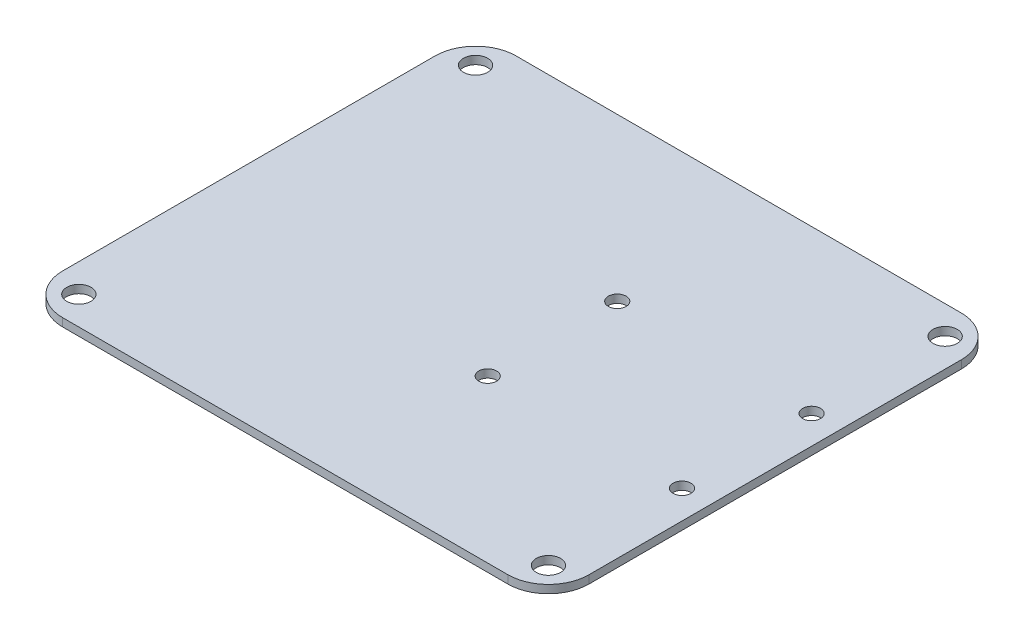
ISO-10303-21;
HEADER;
FILE_DESCRIPTION(('STEP AP214'),'2;1');
FILE_NAME('part.step','',(''),(''),'','','');
FILE_SCHEMA(('AUTOMOTIVE_DESIGN { 1 0 10303 214 1 1 1 1 }'));
ENDSEC;
DATA;
#1=APPLICATION_CONTEXT('core data for automotive mechanical design processes');
#2=APPLICATION_PROTOCOL_DEFINITION('international standard','automotive_design',2000,#1);
#3=PRODUCT_CONTEXT('',#1,'mechanical');
#4=PRODUCT('Part','Part','',(#3));
#5=PRODUCT_RELATED_PRODUCT_CATEGORY('part','',(#4));
#6=PRODUCT_DEFINITION_FORMATION('','',#4);
#7=PRODUCT_DEFINITION_CONTEXT('part definition',#1,'design');
#8=PRODUCT_DEFINITION('design','',#6,#7);
#9=PRODUCT_DEFINITION_SHAPE('','',#8);
#10=(LENGTH_UNIT() NAMED_UNIT(*) SI_UNIT(.MILLI.,.METRE.));
#11=(NAMED_UNIT(*) PLANE_ANGLE_UNIT() SI_UNIT($,.RADIAN.));
#12=(NAMED_UNIT(*) SI_UNIT($,.STERADIAN.) SOLID_ANGLE_UNIT());
#13=UNCERTAINTY_MEASURE_WITH_UNIT(LENGTH_MEASURE(1.E-05),#10,'distance_accuracy_value','');
#14=(GEOMETRIC_REPRESENTATION_CONTEXT(3) GLOBAL_UNCERTAINTY_ASSIGNED_CONTEXT((#13)) GLOBAL_UNIT_ASSIGNED_CONTEXT((#10,
#11,#12)) REPRESENTATION_CONTEXT('',''));
#15=CARTESIAN_POINT('',(0.,0.,0.));
#16=DIRECTION('',(0.,0.,1.));
#17=DIRECTION('',(1.,0.,0.));
#18=AXIS2_PLACEMENT_3D('',#15,#16,#17);
#19=CARTESIAN_POINT('',(61.5,1.,0.));
#20=DIRECTION('',(1.,0.,0.));
#21=DIRECTION('',(0.,0.,-1.));
#22=AXIS2_PLACEMENT_3D('',#19,#20,#21);
#23=PLANE('',#22);
#24=DIRECTION('',(0.,0.,1.));
#25=VECTOR('',#24,1.);
#26=CARTESIAN_POINT('',(61.5,1.,0.));
#27=LINE('',#26,#25);
#28=CARTESIAN_POINT('',(61.5,1.,1.49999999999999));
#29=VERTEX_POINT('',#28);
#30=CARTESIAN_POINT('',(61.5,1.,47.5));
#31=VERTEX_POINT('',#30);
#32=EDGE_CURVE('E189',#29,#31,#27,.T.);
#33=ORIENTED_EDGE('',*,*,#32,.T.);
#34=DIRECTION('',(0.,-1.,0.));
#35=VECTOR('',#34,1.);
#36=CARTESIAN_POINT('',(61.5,0.,47.5));
#37=LINE('',#36,#35);
#38=CARTESIAN_POINT('',(61.5,0.,47.5));
#39=VERTEX_POINT('',#38);
#40=EDGE_CURVE('E132',#31,#39,#37,.T.);
#41=ORIENTED_EDGE('',*,*,#40,.T.);
#42=DIRECTION('',(0.,0.,1.));
#43=VECTOR('',#42,1.);
#44=CARTESIAN_POINT('',(61.5,0.,0.));
#45=LINE('',#44,#43);
#46=CARTESIAN_POINT('',(61.5,0.,1.49999999999999));
#47=VERTEX_POINT('',#46);
#48=EDGE_CURVE('E115',#47,#39,#45,.T.);
#49=ORIENTED_EDGE('',*,*,#48,.F.);
#50=DIRECTION('',(0.,-1.,0.));
#51=VECTOR('',#50,1.);
#52=CARTESIAN_POINT('',(61.5,1.,1.49999999999999));
#53=LINE('',#52,#51);
#54=EDGE_CURVE('E129',#47,#29,#53,.F.);
#55=ORIENTED_EDGE('',*,*,#54,.T.);
#56=EDGE_LOOP('',(#33,#41,#49,#55));
#57=FACE_BOUND('',#56,.T.);
#58=ADVANCED_FACE('F44',(#57),#23,.T.);
#59=CARTESIAN_POINT('',(0.,1.,-3.5));
#60=DIRECTION('',(0.,0.,1.));
#61=DIRECTION('',(1.,0.,0.));
#62=AXIS2_PLACEMENT_3D('',#59,#60,#61);
#63=PLANE('',#62);
#64=DIRECTION('',(-1.,0.,0.));
#65=VECTOR('',#64,1.);
#66=CARTESIAN_POINT('',(0.,1.,-3.5));
#67=LINE('',#66,#65);
#68=CARTESIAN_POINT('',(56.5,1.,-3.50000000000001));
#69=VERTEX_POINT('',#68);
#70=CARTESIAN_POINT('',(1.5,1.,-3.5));
#71=VERTEX_POINT('',#70);
#72=EDGE_CURVE('E186',#69,#71,#67,.T.);
#73=ORIENTED_EDGE('',*,*,#72,.F.);
#74=DIRECTION('',(0.,-1.,0.));
#75=VECTOR('',#74,1.);
#76=CARTESIAN_POINT('',(56.5,0.,-3.50000000000001));
#77=LINE('',#76,#75);
#78=CARTESIAN_POINT('',(56.5,0.,-3.50000000000001));
#79=VERTEX_POINT('',#78);
#80=EDGE_CURVE('E179',#69,#79,#77,.T.);
#81=ORIENTED_EDGE('',*,*,#80,.T.);
#82=DIRECTION('',(-1.,0.,0.));
#83=VECTOR('',#82,1.);
#84=CARTESIAN_POINT('',(0.,0.,-3.5));
#85=LINE('',#84,#83);
#86=CARTESIAN_POINT('',(1.5,0.,-3.5));
#87=VERTEX_POINT('',#86);
#88=EDGE_CURVE('E117',#79,#87,#85,.T.);
#89=ORIENTED_EDGE('',*,*,#88,.T.);
#90=DIRECTION('',(0.,-1.,0.));
#91=VECTOR('',#90,1.);
#92=CARTESIAN_POINT('',(1.5,1.,-3.5));
#93=LINE('',#92,#91);
#94=EDGE_CURVE('E176',#87,#71,#93,.F.);
#95=ORIENTED_EDGE('',*,*,#94,.T.);
#96=EDGE_LOOP('',(#73,#81,#89,#95));
#97=FACE_BOUND('',#96,.T.);
#98=ADVANCED_FACE('F184',(#97),#63,.F.);
#99=CARTESIAN_POINT('',(-3.5,1.,0.));
#100=DIRECTION('',(1.,0.,0.));
#101=DIRECTION('',(0.,0.,-1.));
#102=AXIS2_PLACEMENT_3D('',#99,#100,#101);
#103=PLANE('',#102);
#104=DIRECTION('',(0.,0.,1.));
#105=VECTOR('',#104,1.);
#106=CARTESIAN_POINT('',(-3.5,1.,0.));
#107=LINE('',#106,#105);
#108=CARTESIAN_POINT('',(-3.5,1.,1.5));
#109=VERTEX_POINT('',#108);
#110=CARTESIAN_POINT('',(-3.5,1.,47.5));
#111=VERTEX_POINT('',#110);
#112=EDGE_CURVE('E188',#109,#111,#107,.T.);
#113=ORIENTED_EDGE('',*,*,#112,.F.);
#114=DIRECTION('',(0.,-1.,0.));
#115=VECTOR('',#114,1.);
#116=CARTESIAN_POINT('',(-3.5,1.,1.5));
#117=LINE('',#116,#115);
#118=CARTESIAN_POINT('',(-3.5,0.,1.5));
#119=VERTEX_POINT('',#118);
#120=EDGE_CURVE('E11',#109,#119,#117,.T.);
#121=ORIENTED_EDGE('',*,*,#120,.T.);
#122=DIRECTION('',(0.,0.,1.));
#123=VECTOR('',#122,1.);
#124=CARTESIAN_POINT('',(-3.5,0.,0.));
#125=LINE('',#124,#123);
#126=CARTESIAN_POINT('',(-3.5,0.,47.5));
#127=VERTEX_POINT('',#126);
#128=EDGE_CURVE('E230',#119,#127,#125,.T.);
#129=ORIENTED_EDGE('',*,*,#128,.T.);
#130=DIRECTION('',(0.,-1.,0.));
#131=VECTOR('',#130,1.);
#132=CARTESIAN_POINT('',(-3.5,1.,47.5));
#133=LINE('',#132,#131);
#134=EDGE_CURVE('E53',#127,#111,#133,.F.);
#135=ORIENTED_EDGE('',*,*,#134,.T.);
#136=EDGE_LOOP('',(#113,#121,#129,#135));
#137=FACE_BOUND('',#136,.T.);
#138=ADVANCED_FACE('F308',(#137),#103,.F.);
#139=CARTESIAN_POINT('',(34.,1.,16.5));
#140=DIRECTION('',(0.,-1.,0.));
#141=DIRECTION('',(0.,0.,-1.));
#142=AXIS2_PLACEMENT_3D('',#139,#140,#141);
#143=CYLINDRICAL_SURFACE('',#142,1.1);
#144=CARTESIAN_POINT('',(34.,1.,16.5));
#145=DIRECTION('',(0.,1.,0.));
#146=DIRECTION('',(0.,0.,1.));
#147=AXIS2_PLACEMENT_3D('',#144,#145,#146);
#148=CIRCLE('',#147,1.1);
#149=CARTESIAN_POINT('',(34.,1.,17.6));
#150=VERTEX_POINT('',#149);
#151=EDGE_CURVE('E147',#150,#150,#148,.T.);
#152=ORIENTED_EDGE('',*,*,#151,.T.);
#153=EDGE_LOOP('',(#152));
#154=FACE_BOUND('',#153,.T.);
#155=CARTESIAN_POINT('',(34.,0.,16.5));
#156=DIRECTION('',(0.,1.,0.));
#157=DIRECTION('',(0.,0.,1.));
#158=AXIS2_PLACEMENT_3D('',#155,#156,#157);
#159=CIRCLE('',#158,1.1);
#160=CARTESIAN_POINT('',(34.,0.,17.6));
#161=VERTEX_POINT('',#160);
#162=EDGE_CURVE('E256',#161,#161,#159,.T.);
#163=ORIENTED_EDGE('',*,*,#162,.F.);
#164=EDGE_LOOP('',(#163));
#165=FACE_BOUND('',#164,.T.);
#166=ADVANCED_FACE('F342',(#154,#165),#143,.F.);
#167=CARTESIAN_POINT('',(58.,1.,16.5));
#168=DIRECTION('',(0.,-1.,0.));
#169=DIRECTION('',(0.,0.,-1.));
#170=AXIS2_PLACEMENT_3D('',#167,#168,#169);
#171=CYLINDRICAL_SURFACE('',#170,1.1);
#172=CARTESIAN_POINT('',(58.,1.,16.5));
#173=DIRECTION('',(0.,1.,0.));
#174=DIRECTION('',(0.,0.,1.));
#175=AXIS2_PLACEMENT_3D('',#172,#173,#174);
#176=CIRCLE('',#175,1.1);
#177=CARTESIAN_POINT('',(58.,1.,17.6));
#178=VERTEX_POINT('',#177);
#179=EDGE_CURVE('E218',#178,#178,#176,.T.);
#180=ORIENTED_EDGE('',*,*,#179,.T.);
#181=EDGE_LOOP('',(#180));
#182=FACE_BOUND('',#181,.T.);
#183=CARTESIAN_POINT('',(58.,0.,16.5));
#184=DIRECTION('',(0.,1.,0.));
#185=DIRECTION('',(0.,0.,1.));
#186=AXIS2_PLACEMENT_3D('',#183,#184,#185);
#187=CIRCLE('',#186,1.1);
#188=CARTESIAN_POINT('',(58.,0.,17.6));
#189=VERTEX_POINT('',#188);
#190=EDGE_CURVE('E253',#189,#189,#187,.T.);
#191=ORIENTED_EDGE('',*,*,#190,.F.);
#192=EDGE_LOOP('',(#191));
#193=FACE_BOUND('',#192,.T.);
#194=ADVANCED_FACE('F346',(#182,#193),#171,.F.);
#195=CARTESIAN_POINT('',(58.,1.,49.));
#196=DIRECTION('',(0.,-1.,0.));
#197=DIRECTION('',(0.,0.,-1.));
#198=AXIS2_PLACEMENT_3D('',#195,#196,#197);
#199=CYLINDRICAL_SURFACE('',#198,1.5);
#200=CARTESIAN_POINT('',(58.,1.,49.));
#201=DIRECTION('',(0.,1.,0.));
#202=DIRECTION('',(0.,0.,1.));
#203=AXIS2_PLACEMENT_3D('',#200,#201,#202);
#204=CIRCLE('',#203,1.5);
#205=CARTESIAN_POINT('',(58.,1.,50.5));
#206=VERTEX_POINT('',#205);
#207=EDGE_CURVE('E214',#206,#206,#204,.T.);
#208=ORIENTED_EDGE('',*,*,#207,.T.);
#209=EDGE_LOOP('',(#208));
#210=FACE_BOUND('',#209,.T.);
#211=CARTESIAN_POINT('',(58.,0.,49.));
#212=DIRECTION('',(0.,1.,0.));
#213=DIRECTION('',(0.,0.,1.));
#214=AXIS2_PLACEMENT_3D('',#211,#212,#213);
#215=CIRCLE('',#214,1.5);
#216=CARTESIAN_POINT('',(58.,0.,50.5));
#217=VERTEX_POINT('',#216);
#218=EDGE_CURVE('E249',#217,#217,#215,.T.);
#219=ORIENTED_EDGE('',*,*,#218,.F.);
#220=EDGE_LOOP('',(#219));
#221=FACE_BOUND('',#220,.T.);
#222=ADVANCED_FACE('F351',(#210,#221),#199,.F.);
#223=CARTESIAN_POINT('',(0.,1.,49.));
#224=DIRECTION('',(0.,-1.,0.));
#225=DIRECTION('',(0.,0.,-1.));
#226=AXIS2_PLACEMENT_3D('',#223,#224,#225);
#227=CYLINDRICAL_SURFACE('',#226,1.5);
#228=CARTESIAN_POINT('',(0.,1.,49.));
#229=DIRECTION('',(0.,1.,0.));
#230=DIRECTION('',(0.,0.,1.));
#231=AXIS2_PLACEMENT_3D('',#228,#229,#230);
#232=CIRCLE('',#231,1.5);
#233=CARTESIAN_POINT('',(0.,1.,50.5));
#234=VERTEX_POINT('',#233);
#235=EDGE_CURVE('E210',#234,#234,#232,.T.);
#236=ORIENTED_EDGE('',*,*,#235,.T.);
#237=EDGE_LOOP('',(#236));
#238=FACE_BOUND('',#237,.T.);
#239=CARTESIAN_POINT('',(0.,0.,49.));
#240=DIRECTION('',(0.,1.,0.));
#241=DIRECTION('',(0.,0.,1.));
#242=AXIS2_PLACEMENT_3D('',#239,#240,#241);
#243=CIRCLE('',#242,1.5);
#244=CARTESIAN_POINT('',(0.,0.,50.5));
#245=VERTEX_POINT('',#244);
#246=EDGE_CURVE('E245',#245,#245,#243,.T.);
#247=ORIENTED_EDGE('',*,*,#246,.F.);
#248=EDGE_LOOP('',(#247));
#249=FACE_BOUND('',#248,.T.);
#250=ADVANCED_FACE('F358',(#238,#249),#227,.F.);
#251=CARTESIAN_POINT('',(34.,1.,32.5));
#252=DIRECTION('',(0.,-1.,0.));
#253=DIRECTION('',(0.,0.,-1.));
#254=AXIS2_PLACEMENT_3D('',#251,#252,#253);
#255=CYLINDRICAL_SURFACE('',#254,1.1);
#256=CARTESIAN_POINT('',(34.,1.,32.5));
#257=DIRECTION('',(0.,1.,0.));
#258=DIRECTION('',(0.,0.,1.));
#259=AXIS2_PLACEMENT_3D('',#256,#257,#258);
#260=CIRCLE('',#259,1.1);
#261=CARTESIAN_POINT('',(34.,1.,33.6));
#262=VERTEX_POINT('',#261);
#263=EDGE_CURVE('E206',#262,#262,#260,.T.);
#264=ORIENTED_EDGE('',*,*,#263,.T.);
#265=EDGE_LOOP('',(#264));
#266=FACE_BOUND('',#265,.T.);
#267=CARTESIAN_POINT('',(34.,0.,32.5));
#268=DIRECTION('',(0.,1.,0.));
#269=DIRECTION('',(0.,0.,1.));
#270=AXIS2_PLACEMENT_3D('',#267,#268,#269);
#271=CIRCLE('',#270,1.1);
#272=CARTESIAN_POINT('',(34.,0.,33.6));
#273=VERTEX_POINT('',#272);
#274=EDGE_CURVE('E241',#273,#273,#271,.T.);
#275=ORIENTED_EDGE('',*,*,#274,.F.);
#276=EDGE_LOOP('',(#275));
#277=FACE_BOUND('',#276,.T.);
#278=ADVANCED_FACE('F337',(#266,#277),#255,.F.);
#279=CARTESIAN_POINT('',(0.,1.,0.));
#280=DIRECTION('',(0.,-1.,0.));
#281=DIRECTION('',(0.,0.,-1.));
#282=AXIS2_PLACEMENT_3D('',#279,#280,#281);
#283=CYLINDRICAL_SURFACE('',#282,1.5);
#284=CARTESIAN_POINT('',(0.,1.,0.));
#285=DIRECTION('',(0.,1.,0.));
#286=DIRECTION('',(0.,0.,1.));
#287=AXIS2_PLACEMENT_3D('',#284,#285,#286);
#288=CIRCLE('',#287,1.5);
#289=CARTESIAN_POINT('',(0.,1.,1.5));
#290=VERTEX_POINT('',#289);
#291=EDGE_CURVE('E202',#290,#290,#288,.T.);
#292=ORIENTED_EDGE('',*,*,#291,.T.);
#293=EDGE_LOOP('',(#292));
#294=FACE_BOUND('',#293,.T.);
#295=CARTESIAN_POINT('',(0.,0.,0.));
#296=DIRECTION('',(0.,1.,0.));
#297=DIRECTION('',(0.,0.,1.));
#298=AXIS2_PLACEMENT_3D('',#295,#296,#297);
#299=CIRCLE('',#298,1.5);
#300=CARTESIAN_POINT('',(0.,0.,1.5));
#301=VERTEX_POINT('',#300);
#302=EDGE_CURVE('E237',#301,#301,#299,.T.);
#303=ORIENTED_EDGE('',*,*,#302,.F.);
#304=EDGE_LOOP('',(#303));
#305=FACE_BOUND('',#304,.T.);
#306=ADVANCED_FACE('F332',(#294,#305),#283,.F.);
#307=CARTESIAN_POINT('',(0.,1.,52.5));
#308=DIRECTION('',(0.,0.,-1.));
#309=DIRECTION('',(-1.,0.,0.));
#310=AXIS2_PLACEMENT_3D('',#307,#308,#309);
#311=PLANE('',#310);
#312=DIRECTION('',(1.,0.,0.));
#313=VECTOR('',#312,1.);
#314=CARTESIAN_POINT('',(0.,0.,52.5));
#315=LINE('',#314,#313);
#316=CARTESIAN_POINT('',(1.5,0.,52.5));
#317=VERTEX_POINT('',#316);
#318=CARTESIAN_POINT('',(56.5,0.,52.5));
#319=VERTEX_POINT('',#318);
#320=EDGE_CURVE('E233',#317,#319,#315,.T.);
#321=ORIENTED_EDGE('',*,*,#320,.T.);
#322=DIRECTION('',(0.,-1.,0.));
#323=VECTOR('',#322,1.);
#324=CARTESIAN_POINT('',(56.5,1.,52.5));
#325=LINE('',#324,#323);
#326=CARTESIAN_POINT('',(56.5,1.,52.5));
#327=VERTEX_POINT('',#326);
#328=EDGE_CURVE('E163',#319,#327,#325,.F.);
#329=ORIENTED_EDGE('',*,*,#328,.T.);
#330=DIRECTION('',(1.,0.,0.));
#331=VECTOR('',#330,1.);
#332=CARTESIAN_POINT('',(0.,1.,52.5));
#333=LINE('',#332,#331);
#334=CARTESIAN_POINT('',(1.5,1.,52.5));
#335=VERTEX_POINT('',#334);
#336=EDGE_CURVE('E193',#335,#327,#333,.T.);
#337=ORIENTED_EDGE('',*,*,#336,.F.);
#338=DIRECTION('',(0.,-1.,0.));
#339=VECTOR('',#338,1.);
#340=CARTESIAN_POINT('',(1.5,1.,52.5));
#341=LINE('',#340,#339);
#342=EDGE_CURVE('E159',#335,#317,#341,.T.);
#343=ORIENTED_EDGE('',*,*,#342,.T.);
#344=EDGE_LOOP('',(#321,#329,#337,#343));
#345=FACE_BOUND('',#344,.T.);
#346=ADVANCED_FACE('F299',(#345),#311,.F.);
#347=CARTESIAN_POINT('',(58.,1.,32.5));
#348=DIRECTION('',(0.,-1.,0.));
#349=DIRECTION('',(0.,0.,-1.));
#350=AXIS2_PLACEMENT_3D('',#347,#348,#349);
#351=CYLINDRICAL_SURFACE('',#350,1.1);
#352=CARTESIAN_POINT('',(58.,1.,32.5));
#353=DIRECTION('',(0.,1.,0.));
#354=DIRECTION('',(0.,0.,1.));
#355=AXIS2_PLACEMENT_3D('',#352,#353,#354);
#356=CIRCLE('',#355,1.1);
#357=CARTESIAN_POINT('',(58.,1.,33.6));
#358=VERTEX_POINT('',#357);
#359=EDGE_CURVE('E195',#358,#358,#356,.T.);
#360=ORIENTED_EDGE('',*,*,#359,.T.);
#361=EDGE_LOOP('',(#360));
#362=FACE_BOUND('',#361,.T.);
#363=CARTESIAN_POINT('',(58.,0.,32.5));
#364=DIRECTION('',(0.,1.,0.));
#365=DIRECTION('',(0.,0.,1.));
#366=AXIS2_PLACEMENT_3D('',#363,#364,#365);
#367=CIRCLE('',#366,1.1);
#368=CARTESIAN_POINT('',(58.,0.,33.6));
#369=VERTEX_POINT('',#368);
#370=EDGE_CURVE('E134',#369,#369,#367,.T.);
#371=ORIENTED_EDGE('',*,*,#370,.F.);
#372=EDGE_LOOP('',(#371));
#373=FACE_BOUND('',#372,.T.);
#374=ADVANCED_FACE('F269',(#362,#373),#351,.F.);
#375=CARTESIAN_POINT('',(58.,1.,0.));
#376=DIRECTION('',(0.,-1.,0.));
#377=DIRECTION('',(0.,0.,-1.));
#378=AXIS2_PLACEMENT_3D('',#375,#376,#377);
#379=CYLINDRICAL_SURFACE('',#378,1.5);
#380=CARTESIAN_POINT('',(58.,1.,0.));
#381=DIRECTION('',(0.,1.,0.));
#382=DIRECTION('',(0.,0.,1.));
#383=AXIS2_PLACEMENT_3D('',#380,#381,#382);
#384=CIRCLE('',#383,1.5);
#385=CARTESIAN_POINT('',(58.,1.,1.5));
#386=VERTEX_POINT('',#385);
#387=EDGE_CURVE('E140',#386,#386,#384,.T.);
#388=ORIENTED_EDGE('',*,*,#387,.T.);
#389=EDGE_LOOP('',(#388));
#390=FACE_BOUND('',#389,.T.);
#391=CARTESIAN_POINT('',(58.,0.,0.));
#392=DIRECTION('',(0.,1.,0.));
#393=DIRECTION('',(0.,0.,1.));
#394=AXIS2_PLACEMENT_3D('',#391,#392,#393);
#395=CIRCLE('',#394,1.5);
#396=CARTESIAN_POINT('',(58.,0.,1.5));
#397=VERTEX_POINT('',#396);
#398=EDGE_CURVE('E150',#397,#397,#395,.T.);
#399=ORIENTED_EDGE('',*,*,#398,.F.);
#400=EDGE_LOOP('',(#399));
#401=FACE_BOUND('',#400,.T.);
#402=ADVANCED_FACE('F274',(#390,#401),#379,.F.);
#403=CARTESIAN_POINT('',(0.,1.,0.));
#404=DIRECTION('',(0.,1.,0.));
#405=DIRECTION('',(0.,0.,1.));
#406=AXIS2_PLACEMENT_3D('',#403,#404,#405);
#407=PLANE('',#406);
#408=ORIENTED_EDGE('',*,*,#359,.F.);
#409=EDGE_LOOP('',(#408));
#410=FACE_BOUND('',#409,.T.);
#411=ORIENTED_EDGE('',*,*,#336,.T.);
#412=CARTESIAN_POINT('',(56.5,1.,47.5));
#413=DIRECTION('',(0.,1.,0.));
#414=DIRECTION('',(0.,0.,1.));
#415=AXIS2_PLACEMENT_3D('',#412,#413,#414);
#416=CIRCLE('',#415,5.);
#417=EDGE_CURVE('E173',#327,#31,#416,.T.);
#418=ORIENTED_EDGE('',*,*,#417,.T.);
#419=ORIENTED_EDGE('',*,*,#32,.F.);
#420=CARTESIAN_POINT('',(56.5,1.,1.49999999999999));
#421=DIRECTION('',(0.,1.,0.));
#422=DIRECTION('',(0.,0.,1.));
#423=AXIS2_PLACEMENT_3D('',#420,#421,#422);
#424=CIRCLE('',#423,5.);
#425=EDGE_CURVE('E138',#29,#69,#424,.T.);
#426=ORIENTED_EDGE('',*,*,#425,.T.);
#427=ORIENTED_EDGE('',*,*,#72,.T.);
#428=CARTESIAN_POINT('',(1.5,1.,1.5));
#429=DIRECTION('',(0.,1.,0.));
#430=DIRECTION('',(0.,0.,1.));
#431=AXIS2_PLACEMENT_3D('',#428,#429,#430);
#432=CIRCLE('',#431,5.);
#433=EDGE_CURVE('E66',#71,#109,#432,.T.);
#434=ORIENTED_EDGE('',*,*,#433,.T.);
#435=ORIENTED_EDGE('',*,*,#112,.T.);
#436=CARTESIAN_POINT('',(1.5,1.,47.5));
#437=DIRECTION('',(0.,1.,0.));
#438=DIRECTION('',(0.,0.,1.));
#439=AXIS2_PLACEMENT_3D('',#436,#437,#438);
#440=CIRCLE('',#439,5.);
#441=EDGE_CURVE('E166',#111,#335,#440,.T.);
#442=ORIENTED_EDGE('',*,*,#441,.T.);
#443=EDGE_LOOP('',(#411,#418,#419,#426,#427,#434,#435,#442));
#444=FACE_BOUND('',#443,.T.);
#445=ORIENTED_EDGE('',*,*,#291,.F.);
#446=EDGE_LOOP('',(#445));
#447=FACE_BOUND('',#446,.T.);
#448=ORIENTED_EDGE('',*,*,#263,.F.);
#449=EDGE_LOOP('',(#448));
#450=FACE_BOUND('',#449,.T.);
#451=ORIENTED_EDGE('',*,*,#235,.F.);
#452=EDGE_LOOP('',(#451));
#453=FACE_BOUND('',#452,.T.);
#454=ORIENTED_EDGE('',*,*,#207,.F.);
#455=EDGE_LOOP('',(#454));
#456=FACE_BOUND('',#455,.T.);
#457=ORIENTED_EDGE('',*,*,#179,.F.);
#458=EDGE_LOOP('',(#457));
#459=FACE_BOUND('',#458,.T.);
#460=ORIENTED_EDGE('',*,*,#151,.F.);
#461=EDGE_LOOP('',(#460));
#462=FACE_BOUND('',#461,.T.);
#463=ORIENTED_EDGE('',*,*,#387,.F.);
#464=EDGE_LOOP('',(#463));
#465=FACE_BOUND('',#464,.T.);
#466=ADVANCED_FACE('F272',(#410,#444,#447,#450,#453,#456,#459,#462,#465),#407,.T.);
#467=CARTESIAN_POINT('',(0.,0.,0.));
#468=DIRECTION('',(0.,1.,0.));
#469=DIRECTION('',(0.,0.,1.));
#470=AXIS2_PLACEMENT_3D('',#467,#468,#469);
#471=PLANE('',#470);
#472=ORIENTED_EDGE('',*,*,#370,.T.);
#473=EDGE_LOOP('',(#472));
#474=FACE_BOUND('',#473,.T.);
#475=ORIENTED_EDGE('',*,*,#48,.T.);
#476=CARTESIAN_POINT('',(56.5,0.,47.5));
#477=DIRECTION('',(0.,1.,0.));
#478=DIRECTION('',(0.,0.,1.));
#479=AXIS2_PLACEMENT_3D('',#476,#477,#478);
#480=CIRCLE('',#479,5.);
#481=EDGE_CURVE('E123',#39,#319,#480,.F.);
#482=ORIENTED_EDGE('',*,*,#481,.T.);
#483=ORIENTED_EDGE('',*,*,#320,.F.);
#484=CARTESIAN_POINT('',(1.5,0.,47.5));
#485=DIRECTION('',(0.,1.,0.));
#486=DIRECTION('',(0.,0.,1.));
#487=AXIS2_PLACEMENT_3D('',#484,#485,#486);
#488=CIRCLE('',#487,5.);
#489=EDGE_CURVE('E144',#317,#127,#488,.F.);
#490=ORIENTED_EDGE('',*,*,#489,.T.);
#491=ORIENTED_EDGE('',*,*,#128,.F.);
#492=CARTESIAN_POINT('',(1.5,0.,1.5));
#493=DIRECTION('',(0.,1.,0.));
#494=DIRECTION('',(0.,0.,1.));
#495=AXIS2_PLACEMENT_3D('',#492,#493,#494);
#496=CIRCLE('',#495,5.);
#497=EDGE_CURVE('E124',#119,#87,#496,.F.);
#498=ORIENTED_EDGE('',*,*,#497,.T.);
#499=ORIENTED_EDGE('',*,*,#88,.F.);
#500=CARTESIAN_POINT('',(56.5,0.,1.49999999999999));
#501=DIRECTION('',(0.,1.,0.));
#502=DIRECTION('',(0.,0.,1.));
#503=AXIS2_PLACEMENT_3D('',#500,#501,#502);
#504=CIRCLE('',#503,5.);
#505=EDGE_CURVE('E111',#79,#47,#504,.F.);
#506=ORIENTED_EDGE('',*,*,#505,.T.);
#507=EDGE_LOOP('',(#475,#482,#483,#490,#491,#498,#499,#506));
#508=FACE_BOUND('',#507,.T.);
#509=ORIENTED_EDGE('',*,*,#302,.T.);
#510=EDGE_LOOP('',(#509));
#511=FACE_BOUND('',#510,.T.);
#512=ORIENTED_EDGE('',*,*,#274,.T.);
#513=EDGE_LOOP('',(#512));
#514=FACE_BOUND('',#513,.T.);
#515=ORIENTED_EDGE('',*,*,#246,.T.);
#516=EDGE_LOOP('',(#515));
#517=FACE_BOUND('',#516,.T.);
#518=ORIENTED_EDGE('',*,*,#218,.T.);
#519=EDGE_LOOP('',(#518));
#520=FACE_BOUND('',#519,.T.);
#521=ORIENTED_EDGE('',*,*,#190,.T.);
#522=EDGE_LOOP('',(#521));
#523=FACE_BOUND('',#522,.T.);
#524=ORIENTED_EDGE('',*,*,#162,.T.);
#525=EDGE_LOOP('',(#524));
#526=FACE_BOUND('',#525,.T.);
#527=ORIENTED_EDGE('',*,*,#398,.T.);
#528=EDGE_LOOP('',(#527));
#529=FACE_BOUND('',#528,.T.);
#530=ADVANCED_FACE('F113',(#474,#508,#511,#514,#517,#520,#523,#526,#529),#471,.F.);
#531=CARTESIAN_POINT('',(56.5,1.,47.5));
#532=DIRECTION('',(0.,1.,0.));
#533=DIRECTION('',(0.,0.,1.));
#534=AXIS2_PLACEMENT_3D('',#531,#532,#533);
#535=CYLINDRICAL_SURFACE('',#534,5.);
#536=ORIENTED_EDGE('',*,*,#417,.F.);
#537=ORIENTED_EDGE('',*,*,#328,.F.);
#538=ORIENTED_EDGE('',*,*,#481,.F.);
#539=ORIENTED_EDGE('',*,*,#40,.F.);
#540=EDGE_LOOP('',(#536,#537,#538,#539));
#541=FACE_BOUND('',#540,.T.);
#542=ADVANCED_FACE('F312',(#541),#535,.T.);
#543=CARTESIAN_POINT('',(56.5,1.,1.49999999999999));
#544=DIRECTION('',(0.,1.,0.));
#545=DIRECTION('',(0.,0.,1.));
#546=AXIS2_PLACEMENT_3D('',#543,#544,#545);
#547=CYLINDRICAL_SURFACE('',#546,5.);
#548=ORIENTED_EDGE('',*,*,#425,.F.);
#549=ORIENTED_EDGE('',*,*,#54,.F.);
#550=ORIENTED_EDGE('',*,*,#505,.F.);
#551=ORIENTED_EDGE('',*,*,#80,.F.);
#552=EDGE_LOOP('',(#548,#549,#550,#551));
#553=FACE_BOUND('',#552,.T.);
#554=ADVANCED_FACE('F137',(#553),#547,.T.);
#555=CARTESIAN_POINT('',(1.5,1.,1.5));
#556=DIRECTION('',(0.,-1.,0.));
#557=DIRECTION('',(0.,0.,-1.));
#558=AXIS2_PLACEMENT_3D('',#555,#556,#557);
#559=CYLINDRICAL_SURFACE('',#558,5.);
#560=ORIENTED_EDGE('',*,*,#433,.F.);
#561=ORIENTED_EDGE('',*,*,#94,.F.);
#562=ORIENTED_EDGE('',*,*,#497,.F.);
#563=ORIENTED_EDGE('',*,*,#120,.F.);
#564=EDGE_LOOP('',(#560,#561,#562,#563));
#565=FACE_BOUND('',#564,.T.);
#566=ADVANCED_FACE('F317',(#565),#559,.T.);
#567=CARTESIAN_POINT('',(1.5,1.,47.5));
#568=DIRECTION('',(0.,-1.,0.));
#569=DIRECTION('',(0.,0.,-1.));
#570=AXIS2_PLACEMENT_3D('',#567,#568,#569);
#571=CYLINDRICAL_SURFACE('',#570,5.);
#572=ORIENTED_EDGE('',*,*,#441,.F.);
#573=ORIENTED_EDGE('',*,*,#134,.F.);
#574=ORIENTED_EDGE('',*,*,#489,.F.);
#575=ORIENTED_EDGE('',*,*,#342,.F.);
#576=EDGE_LOOP('',(#572,#573,#574,#575));
#577=FACE_BOUND('',#576,.T.);
#578=ADVANCED_FACE('F46',(#577),#571,.T.);
#579=CLOSED_SHELL('',(#58,#98,#138,#166,#194,#222,#250,#278,#306,#346,#374,#402,#466,#530,#542,
#554,#566,#578));
#580=MANIFOLD_SOLID_BREP('B2',#579);
#581=ADVANCED_BREP_SHAPE_REPRESENTATION('',(#18,#580),#14);
#582=SHAPE_DEFINITION_REPRESENTATION(#9,#581);
ENDSEC;
END-ISO-10303-21;
